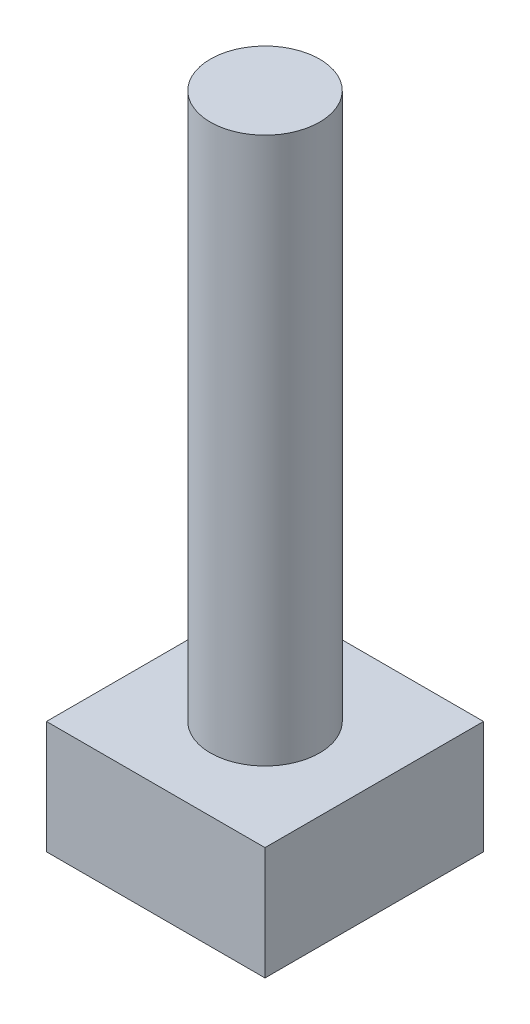
ISO-10303-21;
HEADER;
FILE_DESCRIPTION(('STEP AP214'),'2;1');
FILE_NAME('part.step','',(''),(''),'','','');
FILE_SCHEMA(('AUTOMOTIVE_DESIGN { 1 0 10303 214 1 1 1 1 }'));
ENDSEC;
DATA;
#1=APPLICATION_CONTEXT('core data for automotive mechanical design processes');
#2=APPLICATION_PROTOCOL_DEFINITION('international standard','automotive_design',2000,#1);
#3=PRODUCT_CONTEXT('',#1,'mechanical');
#4=PRODUCT('Part','Part','',(#3));
#5=PRODUCT_RELATED_PRODUCT_CATEGORY('part','',(#4));
#6=PRODUCT_DEFINITION_FORMATION('','',#4);
#7=PRODUCT_DEFINITION_CONTEXT('part definition',#1,'design');
#8=PRODUCT_DEFINITION('design','',#6,#7);
#9=PRODUCT_DEFINITION_SHAPE('','',#8);
#10=(LENGTH_UNIT() NAMED_UNIT(*) SI_UNIT(.MILLI.,.METRE.));
#11=(NAMED_UNIT(*) PLANE_ANGLE_UNIT() SI_UNIT($,.RADIAN.));
#12=(NAMED_UNIT(*) SI_UNIT($,.STERADIAN.) SOLID_ANGLE_UNIT());
#13=UNCERTAINTY_MEASURE_WITH_UNIT(LENGTH_MEASURE(1.E-05),#10,'distance_accuracy_value','');
#14=(GEOMETRIC_REPRESENTATION_CONTEXT(3) GLOBAL_UNCERTAINTY_ASSIGNED_CONTEXT((#13)) GLOBAL_UNIT_ASSIGNED_CONTEXT((#10,
#11,#12)) REPRESENTATION_CONTEXT('',''));
#15=CARTESIAN_POINT('',(0.,0.,0.));
#16=DIRECTION('',(0.,0.,1.));
#17=DIRECTION('',(1.,0.,0.));
#18=AXIS2_PLACEMENT_3D('',#15,#16,#17);
#19=CARTESIAN_POINT('',(-3.,3.1,2.99999999999999));
#20=DIRECTION('',(0.,1.,0.));
#21=DIRECTION('',(0.,0.,1.));
#22=AXIS2_PLACEMENT_3D('',#19,#20,#21);
#23=PLANE('',#22);
#24=DIRECTION('',(0.,0.,1.));
#25=VECTOR('',#24,1.);
#26=CARTESIAN_POINT('',(-3.,3.1,-3.00000000000001));
#27=LINE('',#26,#25);
#28=CARTESIAN_POINT('',(-3.,3.1,-3.00000000000001));
#29=VERTEX_POINT('',#28);
#30=CARTESIAN_POINT('',(-3.,3.1,2.99999999999999));
#31=VERTEX_POINT('',#30);
#32=EDGE_CURVE('E100',#29,#31,#27,.T.);
#33=ORIENTED_EDGE('',*,*,#32,.T.);
#34=DIRECTION('',(1.,0.,0.));
#35=VECTOR('',#34,1.);
#36=CARTESIAN_POINT('',(-3.,3.1,2.99999999999999));
#37=LINE('',#36,#35);
#38=CARTESIAN_POINT('',(3.00000000000002,3.1,2.99999999999999));
#39=VERTEX_POINT('',#38);
#40=EDGE_CURVE('E85',#31,#39,#37,.T.);
#41=ORIENTED_EDGE('',*,*,#40,.T.);
#42=DIRECTION('',(0.,0.,-1.));
#43=VECTOR('',#42,1.);
#44=CARTESIAN_POINT('',(3.,3.1,-3.00000000000001));
#45=LINE('',#44,#43);
#46=CARTESIAN_POINT('',(3.,3.1,-3.00000000000001));
#47=VERTEX_POINT('',#46);
#48=EDGE_CURVE('E52',#39,#47,#45,.T.);
#49=ORIENTED_EDGE('',*,*,#48,.T.);
#50=DIRECTION('',(-1.,0.,0.));
#51=VECTOR('',#50,1.);
#52=CARTESIAN_POINT('',(-3.,3.1,-3.00000000000001));
#53=LINE('',#52,#51);
#54=EDGE_CURVE('E47',#47,#29,#53,.T.);
#55=ORIENTED_EDGE('',*,*,#54,.T.);
#56=EDGE_LOOP('',(#33,#41,#49,#55));
#57=FACE_BOUND('',#56,.T.);
#58=CARTESIAN_POINT('',(0.,3.1,0.));
#59=DIRECTION('',(0.,1.,0.));
#60=DIRECTION('',(0.,0.,1.));
#61=AXIS2_PLACEMENT_3D('',#58,#59,#60);
#62=CIRCLE('',#61,1.5);
#63=CARTESIAN_POINT('',(0.,3.1,1.5));
#64=VERTEX_POINT('',#63);
#65=EDGE_CURVE('E93',#64,#64,#62,.T.);
#66=ORIENTED_EDGE('',*,*,#65,.F.);
#67=EDGE_LOOP('',(#66));
#68=FACE_BOUND('',#67,.T.);
#69=ADVANCED_FACE('F32',(#57,#68),#23,.T.);
#70=CARTESIAN_POINT('',(-3.,3.1,-3.00000000000001));
#71=DIRECTION('',(1.,0.,0.));
#72=DIRECTION('',(0.,0.,-1.));
#73=AXIS2_PLACEMENT_3D('',#70,#71,#72);
#74=PLANE('',#73);
#75=DIRECTION('',(0.,0.,1.));
#76=VECTOR('',#75,1.);
#77=CARTESIAN_POINT('',(-3.,0.,-3.00000000000001));
#78=LINE('',#77,#76);
#79=CARTESIAN_POINT('',(-3.,0.,-3.00000000000001));
#80=VERTEX_POINT('',#79);
#81=CARTESIAN_POINT('',(-3.,0.,2.99999999999999));
#82=VERTEX_POINT('',#81);
#83=EDGE_CURVE('E77',#80,#82,#78,.T.);
#84=ORIENTED_EDGE('',*,*,#83,.T.);
#85=DIRECTION('',(0.,-1.,0.));
#86=VECTOR('',#85,1.);
#87=CARTESIAN_POINT('',(-3.,3.1,2.99999999999999));
#88=LINE('',#87,#86);
#89=EDGE_CURVE('E11',#31,#82,#88,.T.);
#90=ORIENTED_EDGE('',*,*,#89,.F.);
#91=ORIENTED_EDGE('',*,*,#32,.F.);
#92=DIRECTION('',(0.,-1.,0.));
#93=VECTOR('',#92,1.);
#94=CARTESIAN_POINT('',(-3.,3.1,-3.00000000000001));
#95=LINE('',#94,#93);
#96=EDGE_CURVE('E89',#29,#80,#95,.T.);
#97=ORIENTED_EDGE('',*,*,#96,.T.);
#98=EDGE_LOOP('',(#84,#90,#91,#97));
#99=FACE_BOUND('',#98,.T.);
#100=ADVANCED_FACE('F34',(#99),#74,.F.);
#101=CARTESIAN_POINT('',(-3.,3.1,2.99999999999999));
#102=DIRECTION('',(0.,0.,-1.));
#103=DIRECTION('',(-1.,0.,0.));
#104=AXIS2_PLACEMENT_3D('',#101,#102,#103);
#105=PLANE('',#104);
#106=DIRECTION('',(1.,0.,0.));
#107=VECTOR('',#106,1.);
#108=CARTESIAN_POINT('',(-3.,0.,2.99999999999999));
#109=LINE('',#108,#107);
#110=CARTESIAN_POINT('',(3.00000000000002,0.,2.99999999999999));
#111=VERTEX_POINT('',#110);
#112=EDGE_CURVE('E73',#82,#111,#109,.T.);
#113=ORIENTED_EDGE('',*,*,#112,.T.);
#114=DIRECTION('',(0.,-1.,0.));
#115=VECTOR('',#114,1.);
#116=CARTESIAN_POINT('',(3.00000000000002,3.1,2.99999999999999));
#117=LINE('',#116,#115);
#118=EDGE_CURVE('E40',#39,#111,#117,.T.);
#119=ORIENTED_EDGE('',*,*,#118,.F.);
#120=ORIENTED_EDGE('',*,*,#40,.F.);
#121=ORIENTED_EDGE('',*,*,#89,.T.);
#122=EDGE_LOOP('',(#113,#119,#120,#121));
#123=FACE_BOUND('',#122,.T.);
#124=ADVANCED_FACE('F84',(#123),#105,.F.);
#125=CARTESIAN_POINT('',(3.,3.1,-3.00000000000001));
#126=DIRECTION('',(-1.,0.,0.));
#127=DIRECTION('',(0.,0.,1.));
#128=AXIS2_PLACEMENT_3D('',#125,#126,#127);
#129=PLANE('',#128);
#130=DIRECTION('',(0.,0.,-1.));
#131=VECTOR('',#130,1.);
#132=CARTESIAN_POINT('',(3.,0.,-3.00000000000001));
#133=LINE('',#132,#131);
#134=CARTESIAN_POINT('',(3.,0.,-3.00000000000001));
#135=VERTEX_POINT('',#134);
#136=EDGE_CURVE('E78',#111,#135,#133,.T.);
#137=ORIENTED_EDGE('',*,*,#136,.T.);
#138=DIRECTION('',(0.,-1.,0.));
#139=VECTOR('',#138,1.);
#140=CARTESIAN_POINT('',(3.,3.1,-3.00000000000001));
#141=LINE('',#140,#139);
#142=EDGE_CURVE('E106',#47,#135,#141,.T.);
#143=ORIENTED_EDGE('',*,*,#142,.F.);
#144=ORIENTED_EDGE('',*,*,#48,.F.);
#145=ORIENTED_EDGE('',*,*,#118,.T.);
#146=EDGE_LOOP('',(#137,#143,#144,#145));
#147=FACE_BOUND('',#146,.T.);
#148=ADVANCED_FACE('F109',(#147),#129,.F.);
#149=CARTESIAN_POINT('',(-3.,3.1,-3.00000000000001));
#150=DIRECTION('',(0.,0.,1.));
#151=DIRECTION('',(1.,0.,0.));
#152=AXIS2_PLACEMENT_3D('',#149,#150,#151);
#153=PLANE('',#152);
#154=DIRECTION('',(-1.,0.,0.));
#155=VECTOR('',#154,1.);
#156=CARTESIAN_POINT('',(-3.,0.,-3.00000000000001));
#157=LINE('',#156,#155);
#158=EDGE_CURVE('E98',#135,#80,#157,.T.);
#159=ORIENTED_EDGE('',*,*,#158,.T.);
#160=ORIENTED_EDGE('',*,*,#96,.F.);
#161=ORIENTED_EDGE('',*,*,#54,.F.);
#162=ORIENTED_EDGE('',*,*,#142,.T.);
#163=EDGE_LOOP('',(#159,#160,#161,#162));
#164=FACE_BOUND('',#163,.T.);
#165=ADVANCED_FACE('F111',(#164),#153,.F.);
#166=CARTESIAN_POINT('',(-3.,0.,2.99999999999999));
#167=DIRECTION('',(0.,1.,0.));
#168=DIRECTION('',(0.,0.,1.));
#169=AXIS2_PLACEMENT_3D('',#166,#167,#168);
#170=PLANE('',#169);
#171=ORIENTED_EDGE('',*,*,#83,.F.);
#172=ORIENTED_EDGE('',*,*,#158,.F.);
#173=ORIENTED_EDGE('',*,*,#136,.F.);
#174=ORIENTED_EDGE('',*,*,#112,.F.);
#175=EDGE_LOOP('',(#171,#172,#173,#174));
#176=FACE_BOUND('',#175,.T.);
#177=ADVANCED_FACE('F74',(#176),#170,.F.);
#178=CARTESIAN_POINT('',(0.,18.1,0.));
#179=DIRECTION('',(0.,-1.,0.));
#180=DIRECTION('',(0.,0.,-1.));
#181=AXIS2_PLACEMENT_3D('',#178,#179,#180);
#182=CYLINDRICAL_SURFACE('',#181,1.5);
#183=CARTESIAN_POINT('',(0.,18.1,0.));
#184=DIRECTION('',(0.,1.,0.));
#185=DIRECTION('',(0.,0.,1.));
#186=AXIS2_PLACEMENT_3D('',#183,#184,#185);
#187=CIRCLE('',#186,1.5);
#188=CARTESIAN_POINT('',(0.,18.1,1.5));
#189=VERTEX_POINT('',#188);
#190=EDGE_CURVE('E90',#189,#189,#187,.T.);
#191=ORIENTED_EDGE('',*,*,#190,.F.);
#192=EDGE_LOOP('',(#191));
#193=FACE_BOUND('',#192,.T.);
#194=ORIENTED_EDGE('',*,*,#65,.T.);
#195=EDGE_LOOP('',(#194));
#196=FACE_BOUND('',#195,.T.);
#197=ADVANCED_FACE('F118',(#193,#196),#182,.T.);
#198=CARTESIAN_POINT('',(0.,18.1,0.));
#199=DIRECTION('',(0.,1.,0.));
#200=DIRECTION('',(0.,0.,1.));
#201=AXIS2_PLACEMENT_3D('',#198,#199,#200);
#202=PLANE('',#201);
#203=ORIENTED_EDGE('',*,*,#190,.T.);
#204=EDGE_LOOP('',(#203));
#205=FACE_BOUND('',#204,.T.);
#206=ADVANCED_FACE('F120',(#205),#202,.T.);
#207=CLOSED_SHELL('',(#69,#100,#124,#148,#165,#177,#197,#206));
#208=MANIFOLD_SOLID_BREP('B2',#207);
#209=ADVANCED_BREP_SHAPE_REPRESENTATION('',(#18,#208),#14);
#210=SHAPE_DEFINITION_REPRESENTATION(#9,#209);
ENDSEC;
END-ISO-10303-21;
